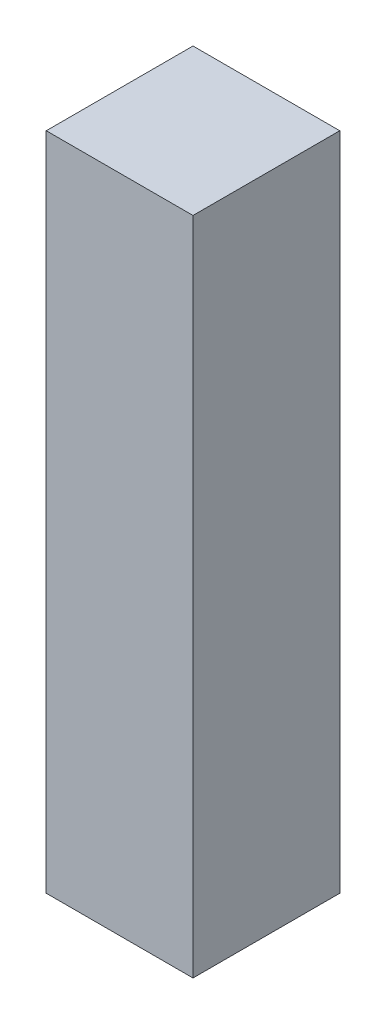
ISO-10303-21;
HEADER;
FILE_DESCRIPTION(('STEP AP214'),'2;1');
FILE_NAME('part.step','',(''),(''),'','','');
FILE_SCHEMA(('AUTOMOTIVE_DESIGN { 1 0 10303 214 1 1 1 1 }'));
ENDSEC;
DATA;
#1=APPLICATION_CONTEXT('core data for automotive mechanical design processes');
#2=APPLICATION_PROTOCOL_DEFINITION('international standard','automotive_design',2000,#1);
#3=PRODUCT_CONTEXT('',#1,'mechanical');
#4=PRODUCT('Part','Part','',(#3));
#5=PRODUCT_RELATED_PRODUCT_CATEGORY('part','',(#4));
#6=PRODUCT_DEFINITION_FORMATION('','',#4);
#7=PRODUCT_DEFINITION_CONTEXT('part definition',#1,'design');
#8=PRODUCT_DEFINITION('design','',#6,#7);
#9=PRODUCT_DEFINITION_SHAPE('','',#8);
#10=(LENGTH_UNIT() NAMED_UNIT(*) SI_UNIT(.MILLI.,.METRE.));
#11=(NAMED_UNIT(*) PLANE_ANGLE_UNIT() SI_UNIT($,.RADIAN.));
#12=(NAMED_UNIT(*) SI_UNIT($,.STERADIAN.) SOLID_ANGLE_UNIT());
#13=UNCERTAINTY_MEASURE_WITH_UNIT(LENGTH_MEASURE(1.E-05),#10,'distance_accuracy_value','');
#14=(GEOMETRIC_REPRESENTATION_CONTEXT(3) GLOBAL_UNCERTAINTY_ASSIGNED_CONTEXT((#13)) GLOBAL_UNIT_ASSIGNED_CONTEXT((#10,
#11,#12)) REPRESENTATION_CONTEXT('',''));
#15=CARTESIAN_POINT('',(0.,0.,0.));
#16=DIRECTION('',(0.,0.,1.));
#17=DIRECTION('',(1.,0.,0.));
#18=AXIS2_PLACEMENT_3D('',#15,#16,#17);
#19=CARTESIAN_POINT('',(10.,90.,-10.));
#20=DIRECTION('',(-1.,0.,0.));
#21=DIRECTION('',(0.,0.,1.));
#22=AXIS2_PLACEMENT_3D('',#19,#20,#21);
#23=PLANE('',#22);
#24=DIRECTION('',(0.,0.,-1.));
#25=VECTOR('',#24,1.);
#26=CARTESIAN_POINT('',(10.,0.,-10.));
#27=LINE('',#26,#25);
#28=CARTESIAN_POINT('',(10.,0.,10.));
#29=VERTEX_POINT('',#28);
#30=CARTESIAN_POINT('',(10.,0.,-10.));
#31=VERTEX_POINT('',#30);
#32=EDGE_CURVE('E104',#29,#31,#27,.T.);
#33=ORIENTED_EDGE('',*,*,#32,.T.);
#34=DIRECTION('',(0.,-1.,0.));
#35=VECTOR('',#34,1.);
#36=CARTESIAN_POINT('',(10.,90.,-10.));
#37=LINE('',#36,#35);
#38=CARTESIAN_POINT('',(10.,90.,-10.));
#39=VERTEX_POINT('',#38);
#40=EDGE_CURVE('E11',#39,#31,#37,.T.);
#41=ORIENTED_EDGE('',*,*,#40,.F.);
#42=DIRECTION('',(0.,0.,-1.));
#43=VECTOR('',#42,1.);
#44=CARTESIAN_POINT('',(10.,90.,-10.));
#45=LINE('',#44,#43);
#46=CARTESIAN_POINT('',(10.,90.,10.));
#47=VERTEX_POINT('',#46);
#48=EDGE_CURVE('E92',#47,#39,#45,.T.);
#49=ORIENTED_EDGE('',*,*,#48,.F.);
#50=DIRECTION('',(0.,-1.,0.));
#51=VECTOR('',#50,1.);
#52=CARTESIAN_POINT('',(10.,90.,10.));
#53=LINE('',#52,#51);
#54=EDGE_CURVE('E100',#47,#29,#53,.T.);
#55=ORIENTED_EDGE('',*,*,#54,.T.);
#56=EDGE_LOOP('',(#33,#41,#49,#55));
#57=FACE_BOUND('',#56,.T.);
#58=ADVANCED_FACE('F41',(#57),#23,.F.);
#59=CARTESIAN_POINT('',(-10.,90.,-10.));
#60=DIRECTION('',(0.,0.,1.));
#61=DIRECTION('',(1.,0.,0.));
#62=AXIS2_PLACEMENT_3D('',#59,#60,#61);
#63=PLANE('',#62);
#64=DIRECTION('',(-1.,0.,0.));
#65=VECTOR('',#64,1.);
#66=CARTESIAN_POINT('',(-10.,0.,-10.));
#67=LINE('',#66,#65);
#68=CARTESIAN_POINT('',(-10.,0.,-10.));
#69=VERTEX_POINT('',#68);
#70=EDGE_CURVE('E96',#31,#69,#67,.T.);
#71=ORIENTED_EDGE('',*,*,#70,.T.);
#72=DIRECTION('',(0.,-1.,0.));
#73=VECTOR('',#72,1.);
#74=CARTESIAN_POINT('',(-10.,90.,-10.));
#75=LINE('',#74,#73);
#76=CARTESIAN_POINT('',(-10.,90.,-10.));
#77=VERTEX_POINT('',#76);
#78=EDGE_CURVE('E49',#77,#69,#75,.T.);
#79=ORIENTED_EDGE('',*,*,#78,.F.);
#80=DIRECTION('',(-1.,0.,0.));
#81=VECTOR('',#80,1.);
#82=CARTESIAN_POINT('',(-10.,90.,-10.));
#83=LINE('',#82,#81);
#84=EDGE_CURVE('E87',#39,#77,#83,.T.);
#85=ORIENTED_EDGE('',*,*,#84,.F.);
#86=ORIENTED_EDGE('',*,*,#40,.T.);
#87=EDGE_LOOP('',(#71,#79,#85,#86));
#88=FACE_BOUND('',#87,.T.);
#89=ADVANCED_FACE('F95',(#88),#63,.F.);
#90=CARTESIAN_POINT('',(-10.,90.,-10.));
#91=DIRECTION('',(1.,0.,0.));
#92=DIRECTION('',(0.,0.,-1.));
#93=AXIS2_PLACEMENT_3D('',#90,#91,#92);
#94=PLANE('',#93);
#95=DIRECTION('',(0.,0.,1.));
#96=VECTOR('',#95,1.);
#97=CARTESIAN_POINT('',(-10.,0.,-10.));
#98=LINE('',#97,#96);
#99=CARTESIAN_POINT('',(-10.,0.,10.));
#100=VERTEX_POINT('',#99);
#101=EDGE_CURVE('E74',#69,#100,#98,.T.);
#102=ORIENTED_EDGE('',*,*,#101,.T.);
#103=DIRECTION('',(0.,-1.,0.));
#104=VECTOR('',#103,1.);
#105=CARTESIAN_POINT('',(-10.,90.,10.));
#106=LINE('',#105,#104);
#107=CARTESIAN_POINT('',(-10.,90.,10.));
#108=VERTEX_POINT('',#107);
#109=EDGE_CURVE('E97',#108,#100,#106,.T.);
#110=ORIENTED_EDGE('',*,*,#109,.F.);
#111=DIRECTION('',(0.,0.,1.));
#112=VECTOR('',#111,1.);
#113=CARTESIAN_POINT('',(-10.,90.,-10.));
#114=LINE('',#113,#112);
#115=EDGE_CURVE('E90',#77,#108,#114,.T.);
#116=ORIENTED_EDGE('',*,*,#115,.F.);
#117=ORIENTED_EDGE('',*,*,#78,.T.);
#118=EDGE_LOOP('',(#102,#110,#116,#117));
#119=FACE_BOUND('',#118,.T.);
#120=ADVANCED_FACE('F98',(#119),#94,.F.);
#121=CARTESIAN_POINT('',(-10.,90.,10.));
#122=DIRECTION('',(0.,0.,-1.));
#123=DIRECTION('',(-1.,0.,0.));
#124=AXIS2_PLACEMENT_3D('',#121,#122,#123);
#125=PLANE('',#124);
#126=DIRECTION('',(1.,0.,0.));
#127=VECTOR('',#126,1.);
#128=CARTESIAN_POINT('',(-10.,0.,10.));
#129=LINE('',#128,#127);
#130=EDGE_CURVE('E80',#100,#29,#129,.T.);
#131=ORIENTED_EDGE('',*,*,#130,.T.);
#132=ORIENTED_EDGE('',*,*,#54,.F.);
#133=DIRECTION('',(1.,0.,0.));
#134=VECTOR('',#133,1.);
#135=CARTESIAN_POINT('',(-10.,90.,10.));
#136=LINE('',#135,#134);
#137=EDGE_CURVE('E57',#108,#47,#136,.T.);
#138=ORIENTED_EDGE('',*,*,#137,.F.);
#139=ORIENTED_EDGE('',*,*,#109,.T.);
#140=EDGE_LOOP('',(#131,#132,#138,#139));
#141=FACE_BOUND('',#140,.T.);
#142=ADVANCED_FACE('F111',(#141),#125,.F.);
#143=CARTESIAN_POINT('',(0.,90.,0.));
#144=DIRECTION('',(0.,1.,0.));
#145=DIRECTION('',(0.,0.,1.));
#146=AXIS2_PLACEMENT_3D('',#143,#144,#145);
#147=PLANE('',#146);
#148=ORIENTED_EDGE('',*,*,#48,.T.);
#149=ORIENTED_EDGE('',*,*,#84,.T.);
#150=ORIENTED_EDGE('',*,*,#115,.T.);
#151=ORIENTED_EDGE('',*,*,#137,.T.);
#152=EDGE_LOOP('',(#148,#149,#150,#151));
#153=FACE_BOUND('',#152,.T.);
#154=ADVANCED_FACE('F88',(#153),#147,.T.);
#155=CARTESIAN_POINT('',(0.,0.,0.));
#156=DIRECTION('',(0.,1.,0.));
#157=DIRECTION('',(0.,0.,1.));
#158=AXIS2_PLACEMENT_3D('',#155,#156,#157);
#159=PLANE('',#158);
#160=ORIENTED_EDGE('',*,*,#32,.F.);
#161=ORIENTED_EDGE('',*,*,#130,.F.);
#162=ORIENTED_EDGE('',*,*,#101,.F.);
#163=ORIENTED_EDGE('',*,*,#70,.F.);
#164=EDGE_LOOP('',(#160,#161,#162,#163));
#165=FACE_BOUND('',#164,.T.);
#166=ADVANCED_FACE('F114',(#165),#159,.F.);
#167=CLOSED_SHELL('',(#58,#89,#120,#142,#154,#166));
#168=MANIFOLD_SOLID_BREP('B2',#167);
#169=ADVANCED_BREP_SHAPE_REPRESENTATION('',(#18,#168),#14);
#170=SHAPE_DEFINITION_REPRESENTATION(#9,#169);
ENDSEC;
END-ISO-10303-21;
